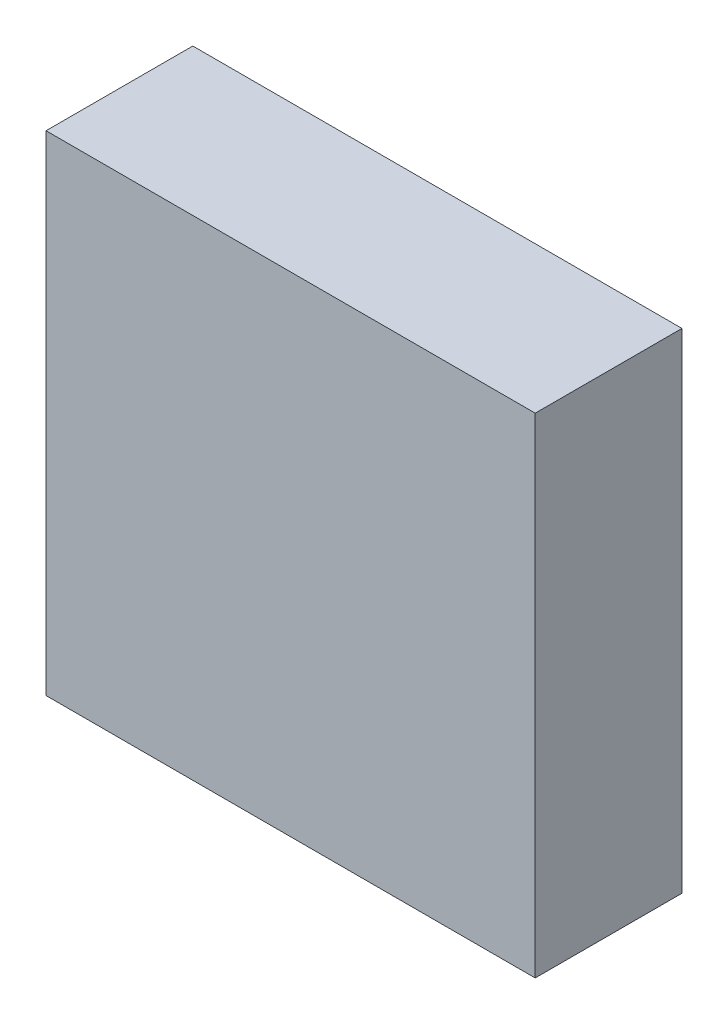
ISO-10303-21;
HEADER;
FILE_DESCRIPTION(('STEP AP214'),'2;1');
FILE_NAME('part.step','',(''),(''),'','','');
FILE_SCHEMA(('AUTOMOTIVE_DESIGN { 1 0 10303 214 1 1 1 1 }'));
ENDSEC;
DATA;
#1=APPLICATION_CONTEXT('core data for automotive mechanical design processes');
#2=APPLICATION_PROTOCOL_DEFINITION('international standard','automotive_design',2000,#1);
#3=PRODUCT_CONTEXT('',#1,'mechanical');
#4=PRODUCT('Part','Part','',(#3));
#5=PRODUCT_RELATED_PRODUCT_CATEGORY('part','',(#4));
#6=PRODUCT_DEFINITION_FORMATION('','',#4);
#7=PRODUCT_DEFINITION_CONTEXT('part definition',#1,'design');
#8=PRODUCT_DEFINITION('design','',#6,#7);
#9=PRODUCT_DEFINITION_SHAPE('','',#8);
#10=(LENGTH_UNIT() NAMED_UNIT(*) SI_UNIT(.MILLI.,.METRE.));
#11=(NAMED_UNIT(*) PLANE_ANGLE_UNIT() SI_UNIT($,.RADIAN.));
#12=(NAMED_UNIT(*) SI_UNIT($,.STERADIAN.) SOLID_ANGLE_UNIT());
#13=UNCERTAINTY_MEASURE_WITH_UNIT(LENGTH_MEASURE(1.E-05),#10,'distance_accuracy_value','');
#14=(GEOMETRIC_REPRESENTATION_CONTEXT(3) GLOBAL_UNCERTAINTY_ASSIGNED_CONTEXT((#13)) GLOBAL_UNIT_ASSIGNED_CONTEXT((#10,
#11,#12)) REPRESENTATION_CONTEXT('',''));
#15=CARTESIAN_POINT('',(0.,0.,0.));
#16=DIRECTION('',(0.,0.,1.));
#17=DIRECTION('',(1.,0.,0.));
#18=AXIS2_PLACEMENT_3D('',#15,#16,#17);
#19=CARTESIAN_POINT('',(5.,-5.,3.));
#20=DIRECTION('',(-1.,0.,0.));
#21=DIRECTION('',(0.,0.,1.));
#22=AXIS2_PLACEMENT_3D('',#19,#20,#21);
#23=PLANE('',#22);
#24=DIRECTION('',(0.,1.,0.));
#25=VECTOR('',#24,1.);
#26=CARTESIAN_POINT('',(5.,-5.,0.));
#27=LINE('',#26,#25);
#28=CARTESIAN_POINT('',(5.,-5.,0.));
#29=VERTEX_POINT('',#28);
#30=CARTESIAN_POINT('',(5.,5.,0.));
#31=VERTEX_POINT('',#30);
#32=EDGE_CURVE('E107',#29,#31,#27,.T.);
#33=ORIENTED_EDGE('',*,*,#32,.T.);
#34=DIRECTION('',(0.,0.,-1.));
#35=VECTOR('',#34,1.);
#36=CARTESIAN_POINT('',(5.,5.,3.));
#37=LINE('',#36,#35);
#38=CARTESIAN_POINT('',(5.,5.,3.));
#39=VERTEX_POINT('',#38);
#40=EDGE_CURVE('E11',#39,#31,#37,.T.);
#41=ORIENTED_EDGE('',*,*,#40,.F.);
#42=DIRECTION('',(0.,1.,0.));
#43=VECTOR('',#42,1.);
#44=CARTESIAN_POINT('',(5.,-5.,3.));
#45=LINE('',#44,#43);
#46=CARTESIAN_POINT('',(5.,-5.,3.));
#47=VERTEX_POINT('',#46);
#48=EDGE_CURVE('E91',#47,#39,#45,.T.);
#49=ORIENTED_EDGE('',*,*,#48,.F.);
#50=DIRECTION('',(0.,0.,-1.));
#51=VECTOR('',#50,1.);
#52=CARTESIAN_POINT('',(5.,-5.,3.));
#53=LINE('',#52,#51);
#54=EDGE_CURVE('E103',#47,#29,#53,.T.);
#55=ORIENTED_EDGE('',*,*,#54,.T.);
#56=EDGE_LOOP('',(#33,#41,#49,#55));
#57=FACE_BOUND('',#56,.T.);
#58=ADVANCED_FACE('F39',(#57),#23,.F.);
#59=CARTESIAN_POINT('',(-5.,5.,3.));
#60=DIRECTION('',(0.,-1.,0.));
#61=DIRECTION('',(0.,0.,-1.));
#62=AXIS2_PLACEMENT_3D('',#59,#60,#61);
#63=PLANE('',#62);
#64=DIRECTION('',(-1.,0.,0.));
#65=VECTOR('',#64,1.);
#66=CARTESIAN_POINT('',(-5.,5.,0.));
#67=LINE('',#66,#65);
#68=CARTESIAN_POINT('',(-5.,5.,0.));
#69=VERTEX_POINT('',#68);
#70=EDGE_CURVE('E96',#31,#69,#67,.T.);
#71=ORIENTED_EDGE('',*,*,#70,.T.);
#72=DIRECTION('',(0.,0.,-1.));
#73=VECTOR('',#72,1.);
#74=CARTESIAN_POINT('',(-5.,5.,3.));
#75=LINE('',#74,#73);
#76=CARTESIAN_POINT('',(-5.,5.,3.));
#77=VERTEX_POINT('',#76);
#78=EDGE_CURVE('E48',#77,#69,#75,.T.);
#79=ORIENTED_EDGE('',*,*,#78,.F.);
#80=DIRECTION('',(-1.,0.,0.));
#81=VECTOR('',#80,1.);
#82=CARTESIAN_POINT('',(-5.,5.,3.));
#83=LINE('',#82,#81);
#84=EDGE_CURVE('E86',#39,#77,#83,.T.);
#85=ORIENTED_EDGE('',*,*,#84,.F.);
#86=ORIENTED_EDGE('',*,*,#40,.T.);
#87=EDGE_LOOP('',(#71,#79,#85,#86));
#88=FACE_BOUND('',#87,.T.);
#89=ADVANCED_FACE('F95',(#88),#63,.F.);
#90=CARTESIAN_POINT('',(-5.,-5.,3.));
#91=DIRECTION('',(1.,0.,0.));
#92=DIRECTION('',(0.,0.,-1.));
#93=AXIS2_PLACEMENT_3D('',#90,#91,#92);
#94=PLANE('',#93);
#95=DIRECTION('',(0.,-1.,0.));
#96=VECTOR('',#95,1.);
#97=CARTESIAN_POINT('',(-5.,-5.,0.));
#98=LINE('',#97,#96);
#99=CARTESIAN_POINT('',(-5.,-5.,0.));
#100=VERTEX_POINT('',#99);
#101=EDGE_CURVE('E73',#69,#100,#98,.T.);
#102=ORIENTED_EDGE('',*,*,#101,.T.);
#103=DIRECTION('',(0.,0.,-1.));
#104=VECTOR('',#103,1.);
#105=CARTESIAN_POINT('',(-5.,-5.,3.));
#106=LINE('',#105,#104);
#107=CARTESIAN_POINT('',(-5.,-5.,3.));
#108=VERTEX_POINT('',#107);
#109=EDGE_CURVE('E98',#108,#100,#106,.T.);
#110=ORIENTED_EDGE('',*,*,#109,.F.);
#111=DIRECTION('',(0.,-1.,0.));
#112=VECTOR('',#111,1.);
#113=CARTESIAN_POINT('',(-5.,-5.,3.));
#114=LINE('',#113,#112);
#115=EDGE_CURVE('E89',#77,#108,#114,.T.);
#116=ORIENTED_EDGE('',*,*,#115,.F.);
#117=ORIENTED_EDGE('',*,*,#78,.T.);
#118=EDGE_LOOP('',(#102,#110,#116,#117));
#119=FACE_BOUND('',#118,.T.);
#120=ADVANCED_FACE('F99',(#119),#94,.F.);
#121=CARTESIAN_POINT('',(-5.,-5.,3.));
#122=DIRECTION('',(0.,1.,0.));
#123=DIRECTION('',(0.,0.,1.));
#124=AXIS2_PLACEMENT_3D('',#121,#122,#123);
#125=PLANE('',#124);
#126=DIRECTION('',(1.,0.,0.));
#127=VECTOR('',#126,1.);
#128=CARTESIAN_POINT('',(-5.,-5.,0.));
#129=LINE('',#128,#127);
#130=EDGE_CURVE('E79',#100,#29,#129,.T.);
#131=ORIENTED_EDGE('',*,*,#130,.T.);
#132=ORIENTED_EDGE('',*,*,#54,.F.);
#133=DIRECTION('',(1.,0.,0.));
#134=VECTOR('',#133,1.);
#135=CARTESIAN_POINT('',(-5.,-5.,3.));
#136=LINE('',#135,#134);
#137=EDGE_CURVE('E56',#108,#47,#136,.T.);
#138=ORIENTED_EDGE('',*,*,#137,.F.);
#139=ORIENTED_EDGE('',*,*,#109,.T.);
#140=EDGE_LOOP('',(#131,#132,#138,#139));
#141=FACE_BOUND('',#140,.T.);
#142=ADVANCED_FACE('F120',(#141),#125,.F.);
#143=CARTESIAN_POINT('',(0.,0.,3.));
#144=DIRECTION('',(0.,0.,-1.));
#145=DIRECTION('',(-1.,0.,0.));
#146=AXIS2_PLACEMENT_3D('',#143,#144,#145);
#147=PLANE('',#146);
#148=ORIENTED_EDGE('',*,*,#48,.T.);
#149=ORIENTED_EDGE('',*,*,#84,.T.);
#150=ORIENTED_EDGE('',*,*,#115,.T.);
#151=ORIENTED_EDGE('',*,*,#137,.T.);
#152=EDGE_LOOP('',(#148,#149,#150,#151));
#153=FACE_BOUND('',#152,.T.);
#154=ADVANCED_FACE('F87',(#153),#147,.F.);
#155=CARTESIAN_POINT('',(0.,0.,0.));
#156=DIRECTION('',(0.,0.,-1.));
#157=DIRECTION('',(-1.,0.,0.));
#158=AXIS2_PLACEMENT_3D('',#155,#156,#157);
#159=PLANE('',#158);
#160=ORIENTED_EDGE('',*,*,#32,.F.);
#161=ORIENTED_EDGE('',*,*,#130,.F.);
#162=ORIENTED_EDGE('',*,*,#101,.F.);
#163=ORIENTED_EDGE('',*,*,#70,.F.);
#164=EDGE_LOOP('',(#160,#161,#162,#163));
#165=FACE_BOUND('',#164,.T.);
#166=ADVANCED_FACE('F123',(#165),#159,.T.);
#167=CLOSED_SHELL('',(#58,#89,#120,#142,#154,#166));
#168=MANIFOLD_SOLID_BREP('B2',#167);
#169=ADVANCED_BREP_SHAPE_REPRESENTATION('',(#18,#168),#14);
#170=SHAPE_DEFINITION_REPRESENTATION(#9,#169);
ENDSEC;
END-ISO-10303-21;
